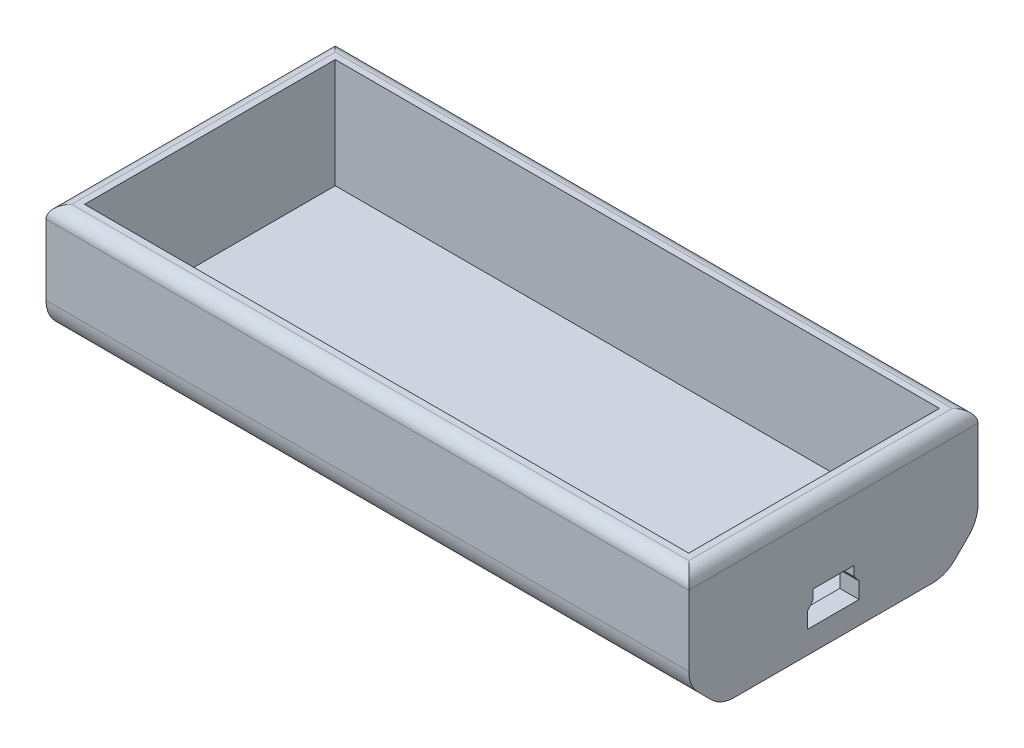
ISO-10303-21;
HEADER;
FILE_DESCRIPTION(('STEP AP214'),'2;1');
FILE_NAME('part.step','',(''),(''),'','','');
FILE_SCHEMA(('AUTOMOTIVE_DESIGN { 1 0 10303 214 1 1 1 1 }'));
ENDSEC;
DATA;
#1=APPLICATION_CONTEXT('core data for automotive mechanical design processes');
#2=APPLICATION_PROTOCOL_DEFINITION('international standard','automotive_design',2000,#1);
#3=PRODUCT_CONTEXT('',#1,'mechanical');
#4=PRODUCT('Part','Part','',(#3));
#5=PRODUCT_RELATED_PRODUCT_CATEGORY('part','',(#4));
#6=PRODUCT_DEFINITION_FORMATION('','',#4);
#7=PRODUCT_DEFINITION_CONTEXT('part definition',#1,'design');
#8=PRODUCT_DEFINITION('design','',#6,#7);
#9=PRODUCT_DEFINITION_SHAPE('','',#8);
#10=(LENGTH_UNIT() NAMED_UNIT(*) SI_UNIT(.MILLI.,.METRE.));
#11=(NAMED_UNIT(*) PLANE_ANGLE_UNIT() SI_UNIT($,.RADIAN.));
#12=(NAMED_UNIT(*) SI_UNIT($,.STERADIAN.) SOLID_ANGLE_UNIT());
#13=UNCERTAINTY_MEASURE_WITH_UNIT(LENGTH_MEASURE(1.E-05),#10,'distance_accuracy_value','');
#14=(GEOMETRIC_REPRESENTATION_CONTEXT(3) GLOBAL_UNCERTAINTY_ASSIGNED_CONTEXT((#13)) GLOBAL_UNIT_ASSIGNED_CONTEXT((#10,
#11,#12)) REPRESENTATION_CONTEXT('',''));
#15=CARTESIAN_POINT('',(0.,0.,0.));
#16=DIRECTION('',(0.,0.,1.));
#17=DIRECTION('',(1.,0.,0.));
#18=AXIS2_PLACEMENT_3D('',#15,#16,#17);
#19=CARTESIAN_POINT('',(50.,20.,-22.5));
#20=DIRECTION('',(-1.,0.,0.));
#21=DIRECTION('',(0.,0.,1.));
#22=AXIS2_PLACEMENT_3D('',#19,#20,#21);
#23=PLANE('',#22);
#24=DIRECTION('',(0.,-1.,0.));
#25=VECTOR('',#24,1.);
#26=CARTESIAN_POINT('',(50.,20.,-22.5));
#27=LINE('',#26,#25);
#28=CARTESIAN_POINT('',(50.,18.,-22.5));
#29=VERTEX_POINT('',#28);
#30=CARTESIAN_POINT('',(50.,7.07106781186547,-22.5));
#31=VERTEX_POINT('',#30);
#32=EDGE_CURVE('E289',#29,#31,#27,.T.);
#33=ORIENTED_EDGE('',*,*,#32,.F.);
#34=DIRECTION('',(0.,0.,-1.));
#35=VECTOR('',#34,1.);
#36=CARTESIAN_POINT('',(50.,18.,22.5));
#37=LINE('',#36,#35);
#38=CARTESIAN_POINT('',(50.,18.,22.5));
#39=VERTEX_POINT('',#38);
#40=EDGE_CURVE('E498',#29,#39,#37,.F.);
#41=ORIENTED_EDGE('',*,*,#40,.T.);
#42=DIRECTION('',(0.,-1.,0.));
#43=VECTOR('',#42,1.);
#44=CARTESIAN_POINT('',(50.,20.,22.5));
#45=LINE('',#44,#43);
#46=CARTESIAN_POINT('',(50.,7.07106781186547,22.5));
#47=VERTEX_POINT('',#46);
#48=EDGE_CURVE('E283',#39,#47,#45,.T.);
#49=ORIENTED_EDGE('',*,*,#48,.T.);
#50=CARTESIAN_POINT('',(50.,7.07106781186547,17.5));
#51=DIRECTION('',(-1.,0.,0.));
#52=DIRECTION('',(0.,0.,1.));
#53=AXIS2_PLACEMENT_3D('',#50,#51,#52);
#54=CIRCLE('',#53,5.);
#55=CARTESIAN_POINT('',(50.,3.53553390593273,21.0355339059327));
#56=VERTEX_POINT('',#55);
#57=EDGE_CURVE('E320',#47,#56,#54,.F.);
#58=ORIENTED_EDGE('',*,*,#57,.T.);
#59=DIRECTION('',(0.,0.707106781186546,0.70710678118655));
#60=VECTOR('',#59,1.);
#61=CARTESIAN_POINT('',(50.,4.99999999999999,22.5));
#62=LINE('',#61,#60);
#63=CARTESIAN_POINT('',(50.,1.46446609406725,18.9644660940672));
#64=VERTEX_POINT('',#63);
#65=EDGE_CURVE('E297',#56,#64,#62,.F.);
#66=ORIENTED_EDGE('',*,*,#65,.T.);
#67=CARTESIAN_POINT('',(50.,5.,15.4289321881345));
#68=DIRECTION('',(-1.,0.,0.));
#69=DIRECTION('',(0.,0.,1.));
#70=AXIS2_PLACEMENT_3D('',#67,#68,#69);
#71=CIRCLE('',#70,5.);
#72=CARTESIAN_POINT('',(50.,0.,15.4289321881345));
#73=VERTEX_POINT('',#72);
#74=EDGE_CURVE('E322',#64,#73,#71,.F.);
#75=ORIENTED_EDGE('',*,*,#74,.T.);
#76=DIRECTION('',(0.,0.,-1.));
#77=VECTOR('',#76,1.);
#78=CARTESIAN_POINT('',(50.,0.,-22.5));
#79=LINE('',#78,#77);
#80=CARTESIAN_POINT('',(50.,0.,-15.4289321881345));
#81=VERTEX_POINT('',#80);
#82=EDGE_CURVE('E257',#73,#81,#79,.T.);
#83=ORIENTED_EDGE('',*,*,#82,.T.);
#84=CARTESIAN_POINT('',(50.,5.,-15.4289321881345));
#85=DIRECTION('',(-1.,0.,0.));
#86=DIRECTION('',(0.,0.,1.));
#87=AXIS2_PLACEMENT_3D('',#84,#85,#86);
#88=CIRCLE('',#87,5.);
#89=CARTESIAN_POINT('',(50.,1.46446609406725,-18.9644660940672));
#90=VERTEX_POINT('',#89);
#91=EDGE_CURVE('E324',#81,#90,#88,.F.);
#92=ORIENTED_EDGE('',*,*,#91,.T.);
#93=DIRECTION('',(0.,-0.707106781186546,0.70710678118655));
#94=VECTOR('',#93,1.);
#95=CARTESIAN_POINT('',(50.,4.99999999999999,-22.5));
#96=LINE('',#95,#94);
#97=CARTESIAN_POINT('',(50.,3.53553390593273,-21.0355339059327));
#98=VERTEX_POINT('',#97);
#99=EDGE_CURVE('E300',#90,#98,#96,.F.);
#100=ORIENTED_EDGE('',*,*,#99,.T.);
#101=CARTESIAN_POINT('',(50.,7.07106781186547,-17.5));
#102=DIRECTION('',(-1.,0.,0.));
#103=DIRECTION('',(0.,0.,1.));
#104=AXIS2_PLACEMENT_3D('',#101,#102,#103);
#105=CIRCLE('',#104,5.);
#106=EDGE_CURVE('E326',#98,#31,#105,.F.);
#107=ORIENTED_EDGE('',*,*,#106,.T.);
#108=EDGE_LOOP('',(#33,#41,#49,#58,#66,#75,#83,#92,#100,#107));
#109=FACE_BOUND('',#108,.T.);
#110=DIRECTION('',(0.,0.780868809443031,-0.624695047554423));
#111=VECTOR('',#110,1.);
#112=CARTESIAN_POINT('',(50.,4.29268292682926,5.36585365853659));
#113=LINE('',#112,#111);
#114=CARTESIAN_POINT('',(50.,6.,4.));
#115=VERTEX_POINT('',#114);
#116=CARTESIAN_POINT('',(50.,7.,3.2));
#117=VERTEX_POINT('',#116);
#118=EDGE_CURVE('E49',#115,#117,#113,.T.);
#119=ORIENTED_EDGE('',*,*,#118,.T.);
#120=DIRECTION('',(0.,-1.,0.));
#121=VECTOR('',#120,1.);
#122=CARTESIAN_POINT('',(50.,0.,3.19999999999999));
#123=LINE('',#122,#121);
#124=CARTESIAN_POINT('',(50.,8.5,3.2));
#125=VERTEX_POINT('',#124);
#126=EDGE_CURVE('E233',#125,#117,#123,.T.);
#127=ORIENTED_EDGE('',*,*,#126,.F.);
#128=DIRECTION('',(0.,0.,-1.));
#129=VECTOR('',#128,1.);
#130=CARTESIAN_POINT('',(50.,8.5,0.));
#131=LINE('',#130,#129);
#132=CARTESIAN_POINT('',(50.,8.5,-3.20000000000001));
#133=VERTEX_POINT('',#132);
#134=EDGE_CURVE('E230',#125,#133,#131,.T.);
#135=ORIENTED_EDGE('',*,*,#134,.T.);
#136=DIRECTION('',(0.,1.,0.));
#137=VECTOR('',#136,1.);
#138=CARTESIAN_POINT('',(50.,0.,-3.20000000000001));
#139=LINE('',#138,#137);
#140=CARTESIAN_POINT('',(50.,7.,-3.20000000000001));
#141=VERTEX_POINT('',#140);
#142=EDGE_CURVE('E227',#141,#133,#139,.T.);
#143=ORIENTED_EDGE('',*,*,#142,.F.);
#144=DIRECTION('',(0.,0.780868809443031,0.624695047554424));
#145=VECTOR('',#144,1.);
#146=CARTESIAN_POINT('',(50.,4.29268292682927,-5.36585365853659));
#147=LINE('',#146,#145);
#148=CARTESIAN_POINT('',(50.,6.,-4.00000000000001));
#149=VERTEX_POINT('',#148);
#150=EDGE_CURVE('E221',#149,#141,#147,.T.);
#151=ORIENTED_EDGE('',*,*,#150,.F.);
#152=DIRECTION('',(0.,-1.,0.));
#153=VECTOR('',#152,1.);
#154=CARTESIAN_POINT('',(50.,0.,-4.00000000000001));
#155=LINE('',#154,#153);
#156=CARTESIAN_POINT('',(50.,3.5,-4.00000000000001));
#157=VERTEX_POINT('',#156);
#158=EDGE_CURVE('E219',#149,#157,#155,.T.);
#159=ORIENTED_EDGE('',*,*,#158,.T.);
#160=DIRECTION('',(0.,0.,-1.));
#161=VECTOR('',#160,1.);
#162=CARTESIAN_POINT('',(50.,3.5,0.));
#163=LINE('',#162,#161);
#164=CARTESIAN_POINT('',(50.,3.5,3.99999999999999));
#165=VERTEX_POINT('',#164);
#166=EDGE_CURVE('E204',#165,#157,#163,.T.);
#167=ORIENTED_EDGE('',*,*,#166,.F.);
#168=DIRECTION('',(0.,-1.,0.));
#169=VECTOR('',#168,1.);
#170=CARTESIAN_POINT('',(50.,0.,3.99999999999999));
#171=LINE('',#170,#169);
#172=EDGE_CURVE('E213',#115,#165,#171,.T.);
#173=ORIENTED_EDGE('',*,*,#172,.F.);
#174=EDGE_LOOP('',(#119,#127,#135,#143,#151,#159,#167,#173));
#175=FACE_BOUND('',#174,.T.);
#176=ADVANCED_FACE('F34',(#109,#175),#23,.F.);
#177=CARTESIAN_POINT('',(47.,20.,-22.5));
#178=DIRECTION('',(-1.,0.,0.));
#179=DIRECTION('',(0.,0.,1.));
#180=AXIS2_PLACEMENT_3D('',#177,#178,#179);
#181=PLANE('',#180);
#182=DIRECTION('',(0.,0.,-1.));
#183=VECTOR('',#182,1.);
#184=CARTESIAN_POINT('',(47.,3.,-22.5));
#185=LINE('',#184,#183);
#186=CARTESIAN_POINT('',(47.,3.,19.5));
#187=VERTEX_POINT('',#186);
#188=CARTESIAN_POINT('',(47.,3.,-19.5));
#189=VERTEX_POINT('',#188);
#190=EDGE_CURVE('E249',#187,#189,#185,.T.);
#191=ORIENTED_EDGE('',*,*,#190,.F.);
#192=DIRECTION('',(0.,-1.,0.));
#193=VECTOR('',#192,1.);
#194=CARTESIAN_POINT('',(47.,20.,19.5));
#195=LINE('',#194,#193);
#196=CARTESIAN_POINT('',(47.,20.,19.5));
#197=VERTEX_POINT('',#196);
#198=EDGE_CURVE('E259',#197,#187,#195,.T.);
#199=ORIENTED_EDGE('',*,*,#198,.F.);
#200=DIRECTION('',(0.,0.,-1.));
#201=VECTOR('',#200,1.);
#202=CARTESIAN_POINT('',(47.,20.,-22.5));
#203=LINE('',#202,#201);
#204=CARTESIAN_POINT('',(47.,20.,-19.5));
#205=VERTEX_POINT('',#204);
#206=EDGE_CURVE('E273',#197,#205,#203,.T.);
#207=ORIENTED_EDGE('',*,*,#206,.T.);
#208=DIRECTION('',(0.,-1.,0.));
#209=VECTOR('',#208,1.);
#210=CARTESIAN_POINT('',(47.,20.,-19.5));
#211=LINE('',#210,#209);
#212=EDGE_CURVE('E254',#205,#189,#211,.T.);
#213=ORIENTED_EDGE('',*,*,#212,.T.);
#214=EDGE_LOOP('',(#191,#199,#207,#213));
#215=FACE_BOUND('',#214,.T.);
#216=DIRECTION('',(0.,1.,0.));
#217=VECTOR('',#216,1.);
#218=CARTESIAN_POINT('',(47.,20.,3.2));
#219=LINE('',#218,#217);
#220=CARTESIAN_POINT('',(47.,7.,3.2));
#221=VERTEX_POINT('',#220);
#222=CARTESIAN_POINT('',(47.,8.5,3.2));
#223=VERTEX_POINT('',#222);
#224=EDGE_CURVE('E42',#221,#223,#219,.T.);
#225=ORIENTED_EDGE('',*,*,#224,.F.);
#226=DIRECTION('',(0.,-0.780868809443031,0.624695047554423));
#227=VECTOR('',#226,1.);
#228=CARTESIAN_POINT('',(47.,27.4634146341463,-13.170731707317));
#229=LINE('',#228,#227);
#230=CARTESIAN_POINT('',(47.,6.,4.));
#231=VERTEX_POINT('',#230);
#232=EDGE_CURVE('E11',#221,#231,#229,.T.);
#233=ORIENTED_EDGE('',*,*,#232,.T.);
#234=DIRECTION('',(0.,1.,0.));
#235=VECTOR('',#234,1.);
#236=CARTESIAN_POINT('',(47.,20.,4.00000000000001));
#237=LINE('',#236,#235);
#238=CARTESIAN_POINT('',(47.,3.5,3.99999999999999));
#239=VERTEX_POINT('',#238);
#240=EDGE_CURVE('E482',#239,#231,#237,.T.);
#241=ORIENTED_EDGE('',*,*,#240,.F.);
#242=DIRECTION('',(0.,0.,1.));
#243=VECTOR('',#242,1.);
#244=CARTESIAN_POINT('',(47.,3.49999999999999,-22.5));
#245=LINE('',#244,#243);
#246=CARTESIAN_POINT('',(47.,3.5,-4.00000000000001));
#247=VERTEX_POINT('',#246);
#248=EDGE_CURVE('E207',#247,#239,#245,.T.);
#249=ORIENTED_EDGE('',*,*,#248,.F.);
#250=DIRECTION('',(0.,1.,0.));
#251=VECTOR('',#250,1.);
#252=CARTESIAN_POINT('',(47.,20.,-4.));
#253=LINE('',#252,#251);
#254=CARTESIAN_POINT('',(47.,6.,-4.00000000000001));
#255=VERTEX_POINT('',#254);
#256=EDGE_CURVE('E478',#247,#255,#253,.T.);
#257=ORIENTED_EDGE('',*,*,#256,.T.);
#258=DIRECTION('',(0.,-0.780868809443031,-0.624695047554424));
#259=VECTOR('',#258,1.);
#260=CARTESIAN_POINT('',(47.,5.51219512195123,-4.39024390243901));
#261=LINE('',#260,#259);
#262=CARTESIAN_POINT('',(47.,7.,-3.20000000000001));
#263=VERTEX_POINT('',#262);
#264=EDGE_CURVE('E474',#263,#255,#261,.T.);
#265=ORIENTED_EDGE('',*,*,#264,.F.);
#266=DIRECTION('',(0.,-1.,0.));
#267=VECTOR('',#266,1.);
#268=CARTESIAN_POINT('',(47.,20.,-3.20000000000001));
#269=LINE('',#268,#267);
#270=CARTESIAN_POINT('',(47.,8.5,-3.20000000000001));
#271=VERTEX_POINT('',#270);
#272=EDGE_CURVE('E472',#271,#263,#269,.T.);
#273=ORIENTED_EDGE('',*,*,#272,.F.);
#274=DIRECTION('',(0.,0.,1.));
#275=VECTOR('',#274,1.);
#276=CARTESIAN_POINT('',(47.,8.5,-22.5));
#277=LINE('',#276,#275);
#278=EDGE_CURVE('E467',#271,#223,#277,.T.);
#279=ORIENTED_EDGE('',*,*,#278,.T.);
#280=EDGE_LOOP('',(#225,#233,#241,#249,#257,#265,#273,#279));
#281=FACE_BOUND('',#280,.T.);
#282=ADVANCED_FACE('F393',(#215,#281),#181,.T.);
#283=CARTESIAN_POINT('',(-50.,20.,-22.5));
#284=DIRECTION('',(0.,0.,1.));
#285=DIRECTION('',(1.,0.,0.));
#286=AXIS2_PLACEMENT_3D('',#283,#284,#285);
#287=PLANE('',#286);
#288=DIRECTION('',(0.,-1.,0.));
#289=VECTOR('',#288,1.);
#290=CARTESIAN_POINT('',(-50.,20.,-22.5));
#291=LINE('',#290,#289);
#292=CARTESIAN_POINT('',(-50.,18.,-22.5));
#293=VERTEX_POINT('',#292);
#294=CARTESIAN_POINT('',(-50.,7.07106781186547,-22.5));
#295=VERTEX_POINT('',#294);
#296=EDGE_CURVE('E287',#293,#295,#291,.T.);
#297=ORIENTED_EDGE('',*,*,#296,.F.);
#298=DIRECTION('',(-1.,0.,0.));
#299=VECTOR('',#298,1.);
#300=CARTESIAN_POINT('',(50.,18.,-22.5));
#301=LINE('',#300,#299);
#302=EDGE_CURVE('E496',#293,#29,#301,.F.);
#303=ORIENTED_EDGE('',*,*,#302,.T.);
#304=ORIENTED_EDGE('',*,*,#32,.T.);
#305=DIRECTION('',(1.,0.,0.));
#306=VECTOR('',#305,1.);
#307=CARTESIAN_POINT('',(-50.,7.07106781186547,-22.5));
#308=LINE('',#307,#306);
#309=EDGE_CURVE('E303',#31,#295,#308,.F.);
#310=ORIENTED_EDGE('',*,*,#309,.T.);
#311=EDGE_LOOP('',(#297,#303,#304,#310));
#312=FACE_BOUND('',#311,.T.);
#313=ADVANCED_FACE('F395',(#312),#287,.F.);
#314=CARTESIAN_POINT('',(-50.,20.,-22.5));
#315=DIRECTION('',(1.,0.,0.));
#316=DIRECTION('',(0.,0.,-1.));
#317=AXIS2_PLACEMENT_3D('',#314,#315,#316);
#318=PLANE('',#317);
#319=DIRECTION('',(0.,-1.,0.));
#320=VECTOR('',#319,1.);
#321=CARTESIAN_POINT('',(-50.,20.,22.5));
#322=LINE('',#321,#320);
#323=CARTESIAN_POINT('',(-50.,18.,22.5));
#324=VERTEX_POINT('',#323);
#325=CARTESIAN_POINT('',(-50.,7.07106781186547,22.5));
#326=VERTEX_POINT('',#325);
#327=EDGE_CURVE('E285',#324,#326,#322,.T.);
#328=ORIENTED_EDGE('',*,*,#327,.F.);
#329=DIRECTION('',(0.,0.,1.));
#330=VECTOR('',#329,1.);
#331=CARTESIAN_POINT('',(-50.,18.,-22.5));
#332=LINE('',#331,#330);
#333=EDGE_CURVE('E494',#324,#293,#332,.F.);
#334=ORIENTED_EDGE('',*,*,#333,.T.);
#335=ORIENTED_EDGE('',*,*,#296,.T.);
#336=CARTESIAN_POINT('',(-50.,7.07106781186547,-17.5));
#337=DIRECTION('',(1.,0.,0.));
#338=DIRECTION('',(0.,0.,-1.));
#339=AXIS2_PLACEMENT_3D('',#336,#337,#338);
#340=CIRCLE('',#339,5.);
#341=CARTESIAN_POINT('',(-50.,3.53553390593273,-21.0355339059327));
#342=VERTEX_POINT('',#341);
#343=EDGE_CURVE('E314',#295,#342,#340,.F.);
#344=ORIENTED_EDGE('',*,*,#343,.T.);
#345=DIRECTION('',(0.,0.707106781186546,-0.70710678118655));
#346=VECTOR('',#345,1.);
#347=CARTESIAN_POINT('',(-50.,4.99999999999999,-22.5));
#348=LINE('',#347,#346);
#349=CARTESIAN_POINT('',(-50.,1.46446609406725,-18.9644660940672));
#350=VERTEX_POINT('',#349);
#351=EDGE_CURVE('E294',#342,#350,#348,.F.);
#352=ORIENTED_EDGE('',*,*,#351,.T.);
#353=CARTESIAN_POINT('',(-50.,5.,-15.4289321881345));
#354=DIRECTION('',(1.,0.,0.));
#355=DIRECTION('',(0.,0.,-1.));
#356=AXIS2_PLACEMENT_3D('',#353,#354,#355);
#357=CIRCLE('',#356,5.);
#358=CARTESIAN_POINT('',(-50.,1.,-18.4289321881345));
#359=VERTEX_POINT('',#358);
#360=EDGE_CURVE('E311',#350,#359,#357,.F.);
#361=ORIENTED_EDGE('',*,*,#360,.T.);
#362=DIRECTION('',(0.,0.,1.));
#363=VECTOR('',#362,1.);
#364=CARTESIAN_POINT('',(-50.,1.,-22.5));
#365=LINE('',#364,#363);
#366=CARTESIAN_POINT('',(-50.,1.,18.4289321881345));
#367=VERTEX_POINT('',#366);
#368=EDGE_CURVE('E341',#359,#367,#365,.T.);
#369=ORIENTED_EDGE('',*,*,#368,.T.);
#370=CARTESIAN_POINT('',(-50.,5.,15.4289321881345));
#371=DIRECTION('',(1.,0.,0.));
#372=DIRECTION('',(0.,0.,-1.));
#373=AXIS2_PLACEMENT_3D('',#370,#371,#372);
#374=CIRCLE('',#373,5.);
#375=CARTESIAN_POINT('',(-50.,1.46446609406725,18.9644660940672));
#376=VERTEX_POINT('',#375);
#377=EDGE_CURVE('E309',#367,#376,#374,.F.);
#378=ORIENTED_EDGE('',*,*,#377,.T.);
#379=DIRECTION('',(0.,-0.707106781186546,-0.70710678118655));
#380=VECTOR('',#379,1.);
#381=CARTESIAN_POINT('',(-50.,4.99999999999999,22.5));
#382=LINE('',#381,#380);
#383=CARTESIAN_POINT('',(-50.,3.53553390593273,21.0355339059327));
#384=VERTEX_POINT('',#383);
#385=EDGE_CURVE('E291',#376,#384,#382,.F.);
#386=ORIENTED_EDGE('',*,*,#385,.T.);
#387=CARTESIAN_POINT('',(-50.,7.07106781186547,17.5));
#388=DIRECTION('',(1.,0.,0.));
#389=DIRECTION('',(0.,0.,-1.));
#390=AXIS2_PLACEMENT_3D('',#387,#388,#389);
#391=CIRCLE('',#390,5.);
#392=EDGE_CURVE('E306',#384,#326,#391,.F.);
#393=ORIENTED_EDGE('',*,*,#392,.T.);
#394=EDGE_LOOP('',(#328,#334,#335,#344,#352,#361,#369,#378,#386,#393));
#395=FACE_BOUND('',#394,.T.);
#396=ADVANCED_FACE('F398',(#395),#318,.F.);
#397=CARTESIAN_POINT('',(-50.,20.,22.5));
#398=DIRECTION('',(0.,0.,-1.));
#399=DIRECTION('',(-1.,0.,0.));
#400=AXIS2_PLACEMENT_3D('',#397,#398,#399);
#401=PLANE('',#400);
#402=ORIENTED_EDGE('',*,*,#48,.F.);
#403=DIRECTION('',(1.,0.,0.));
#404=VECTOR('',#403,1.);
#405=CARTESIAN_POINT('',(-50.,18.,22.5));
#406=LINE('',#405,#404);
#407=EDGE_CURVE('E484',#39,#324,#406,.F.);
#408=ORIENTED_EDGE('',*,*,#407,.T.);
#409=ORIENTED_EDGE('',*,*,#327,.T.);
#410=DIRECTION('',(-1.,0.,0.));
#411=VECTOR('',#410,1.);
#412=CARTESIAN_POINT('',(50.,7.07106781186547,22.5));
#413=LINE('',#412,#411);
#414=EDGE_CURVE('E338',#326,#47,#413,.F.);
#415=ORIENTED_EDGE('',*,*,#414,.T.);
#416=EDGE_LOOP('',(#402,#408,#409,#415));
#417=FACE_BOUND('',#416,.T.);
#418=ADVANCED_FACE('F402',(#417),#401,.F.);
#419=CARTESIAN_POINT('',(0.,20.,0.));
#420=DIRECTION('',(0.,1.,0.));
#421=DIRECTION('',(0.,0.,1.));
#422=AXIS2_PLACEMENT_3D('',#419,#420,#421);
#423=PLANE('',#422);
#424=DIRECTION('',(1.,0.,0.));
#425=VECTOR('',#424,1.);
#426=CARTESIAN_POINT('',(50.,20.,20.5));
#427=LINE('',#426,#425);
#428=CARTESIAN_POINT('',(-48.,20.,20.5));
#429=VERTEX_POINT('',#428);
#430=CARTESIAN_POINT('',(48.,20.,20.5));
#431=VERTEX_POINT('',#430);
#432=EDGE_CURVE('E371',#429,#431,#427,.T.);
#433=ORIENTED_EDGE('',*,*,#432,.T.);
#434=DIRECTION('',(0.,0.,-1.));
#435=VECTOR('',#434,1.);
#436=CARTESIAN_POINT('',(48.,20.,-22.5));
#437=LINE('',#436,#435);
#438=CARTESIAN_POINT('',(48.,20.,-20.5));
#439=VERTEX_POINT('',#438);
#440=EDGE_CURVE('E501',#431,#439,#437,.T.);
#441=ORIENTED_EDGE('',*,*,#440,.T.);
#442=DIRECTION('',(-1.,0.,0.));
#443=VECTOR('',#442,1.);
#444=CARTESIAN_POINT('',(-50.,20.,-20.5));
#445=LINE('',#444,#443);
#446=CARTESIAN_POINT('',(-48.,20.,-20.5));
#447=VERTEX_POINT('',#446);
#448=EDGE_CURVE('E504',#439,#447,#445,.T.);
#449=ORIENTED_EDGE('',*,*,#448,.T.);
#450=DIRECTION('',(0.,0.,1.));
#451=VECTOR('',#450,1.);
#452=CARTESIAN_POINT('',(-48.,20.,22.5));
#453=LINE('',#452,#451);
#454=EDGE_CURVE('E505',#447,#429,#453,.T.);
#455=ORIENTED_EDGE('',*,*,#454,.T.);
#456=EDGE_LOOP('',(#433,#441,#449,#455));
#457=FACE_BOUND('',#456,.T.);
#458=ORIENTED_EDGE('',*,*,#206,.F.);
#459=DIRECTION('',(1.,0.,0.));
#460=VECTOR('',#459,1.);
#461=CARTESIAN_POINT('',(-50.,20.,19.5));
#462=LINE('',#461,#460);
#463=CARTESIAN_POINT('',(-47.,20.,19.5));
#464=VERTEX_POINT('',#463);
#465=EDGE_CURVE('E263',#464,#197,#462,.T.);
#466=ORIENTED_EDGE('',*,*,#465,.F.);
#467=DIRECTION('',(0.,0.,1.));
#468=VECTOR('',#467,1.);
#469=CARTESIAN_POINT('',(-47.,20.,-22.5));
#470=LINE('',#469,#468);
#471=CARTESIAN_POINT('',(-47.,20.,-19.5));
#472=VERTEX_POINT('',#471);
#473=EDGE_CURVE('E277',#472,#464,#470,.T.);
#474=ORIENTED_EDGE('',*,*,#473,.F.);
#475=DIRECTION('',(-1.,0.,0.));
#476=VECTOR('',#475,1.);
#477=CARTESIAN_POINT('',(-50.,20.,-19.5));
#478=LINE('',#477,#476);
#479=EDGE_CURVE('E275',#205,#472,#478,.T.);
#480=ORIENTED_EDGE('',*,*,#479,.F.);
#481=EDGE_LOOP('',(#458,#466,#474,#480));
#482=FACE_BOUND('',#481,.T.);
#483=ADVANCED_FACE('F406',(#457,#482),#423,.T.);
#484=CARTESIAN_POINT('',(0.,0.,0.));
#485=DIRECTION('',(0.,1.,0.));
#486=DIRECTION('',(0.,0.,1.));
#487=AXIS2_PLACEMENT_3D('',#484,#485,#486);
#488=PLANE('',#487);
#489=DIRECTION('',(1.,0.,0.));
#490=VECTOR('',#489,1.);
#491=CARTESIAN_POINT('',(-50.,0.,15.4289321881345));
#492=LINE('',#491,#490);
#493=CARTESIAN_POINT('',(-49.,0.,15.4289321881345));
#494=VERTEX_POINT('',#493);
#495=EDGE_CURVE('E329',#73,#494,#492,.F.);
#496=ORIENTED_EDGE('',*,*,#495,.T.);
#497=DIRECTION('',(0.,0.,1.));
#498=VECTOR('',#497,1.);
#499=CARTESIAN_POINT('',(-49.,0.,0.));
#500=LINE('',#499,#498);
#501=CARTESIAN_POINT('',(-49.,0.,-15.4289321881345));
#502=VERTEX_POINT('',#501);
#503=EDGE_CURVE('E351',#494,#502,#500,.F.);
#504=ORIENTED_EDGE('',*,*,#503,.T.);
#505=DIRECTION('',(-1.,0.,0.));
#506=VECTOR('',#505,1.);
#507=CARTESIAN_POINT('',(50.,0.,-15.4289321881345));
#508=LINE('',#507,#506);
#509=EDGE_CURVE('E332',#502,#81,#508,.F.);
#510=ORIENTED_EDGE('',*,*,#509,.T.);
#511=ORIENTED_EDGE('',*,*,#82,.F.);
#512=EDGE_LOOP('',(#496,#504,#510,#511));
#513=FACE_BOUND('',#512,.T.);
#514=ADVANCED_FACE('F408',(#513),#488,.F.);
#515=CARTESIAN_POINT('',(-50.,20.,-19.5));
#516=DIRECTION('',(0.,0.,1.));
#517=DIRECTION('',(1.,0.,0.));
#518=AXIS2_PLACEMENT_3D('',#515,#516,#517);
#519=PLANE('',#518);
#520=DIRECTION('',(-1.,0.,0.));
#521=VECTOR('',#520,1.);
#522=CARTESIAN_POINT('',(-50.,3.,-19.5));
#523=LINE('',#522,#521);
#524=CARTESIAN_POINT('',(-47.,3.,-19.5));
#525=VERTEX_POINT('',#524);
#526=EDGE_CURVE('E252',#189,#525,#523,.T.);
#527=ORIENTED_EDGE('',*,*,#526,.F.);
#528=ORIENTED_EDGE('',*,*,#212,.F.);
#529=ORIENTED_EDGE('',*,*,#479,.T.);
#530=DIRECTION('',(0.,-1.,0.));
#531=VECTOR('',#530,1.);
#532=CARTESIAN_POINT('',(-47.,20.,-19.5));
#533=LINE('',#532,#531);
#534=EDGE_CURVE('E258',#472,#525,#533,.T.);
#535=ORIENTED_EDGE('',*,*,#534,.T.);
#536=EDGE_LOOP('',(#527,#528,#529,#535));
#537=FACE_BOUND('',#536,.T.);
#538=ADVANCED_FACE('F411',(#537),#519,.T.);
#539=CARTESIAN_POINT('',(-47.,20.,-22.5));
#540=DIRECTION('',(1.,0.,0.));
#541=DIRECTION('',(0.,0.,-1.));
#542=AXIS2_PLACEMENT_3D('',#539,#540,#541);
#543=PLANE('',#542);
#544=DIRECTION('',(0.,0.,1.));
#545=VECTOR('',#544,1.);
#546=CARTESIAN_POINT('',(-47.,3.,-22.5));
#547=LINE('',#546,#545);
#548=CARTESIAN_POINT('',(-47.,3.,19.5));
#549=VERTEX_POINT('',#548);
#550=EDGE_CURVE('E265',#525,#549,#547,.T.);
#551=ORIENTED_EDGE('',*,*,#550,.F.);
#552=ORIENTED_EDGE('',*,*,#534,.F.);
#553=ORIENTED_EDGE('',*,*,#473,.T.);
#554=DIRECTION('',(0.,-1.,0.));
#555=VECTOR('',#554,1.);
#556=CARTESIAN_POINT('',(-47.,20.,19.5));
#557=LINE('',#556,#555);
#558=EDGE_CURVE('E262',#464,#549,#557,.T.);
#559=ORIENTED_EDGE('',*,*,#558,.T.);
#560=EDGE_LOOP('',(#551,#552,#553,#559));
#561=FACE_BOUND('',#560,.T.);
#562=ADVANCED_FACE('F422',(#561),#543,.T.);
#563=CARTESIAN_POINT('',(-50.,20.,19.5));
#564=DIRECTION('',(0.,0.,-1.));
#565=DIRECTION('',(-1.,0.,0.));
#566=AXIS2_PLACEMENT_3D('',#563,#564,#565);
#567=PLANE('',#566);
#568=DIRECTION('',(1.,0.,0.));
#569=VECTOR('',#568,1.);
#570=CARTESIAN_POINT('',(-50.,3.,19.5));
#571=LINE('',#570,#569);
#572=EDGE_CURVE('E269',#549,#187,#571,.T.);
#573=ORIENTED_EDGE('',*,*,#572,.F.);
#574=ORIENTED_EDGE('',*,*,#558,.F.);
#575=ORIENTED_EDGE('',*,*,#465,.T.);
#576=ORIENTED_EDGE('',*,*,#198,.T.);
#577=EDGE_LOOP('',(#573,#574,#575,#576));
#578=FACE_BOUND('',#577,.T.);
#579=ADVANCED_FACE('F418',(#578),#567,.T.);
#580=CARTESIAN_POINT('',(0.,3.,0.));
#581=DIRECTION('',(0.,1.,0.));
#582=DIRECTION('',(0.,0.,1.));
#583=AXIS2_PLACEMENT_3D('',#580,#581,#582);
#584=PLANE('',#583);
#585=ORIENTED_EDGE('',*,*,#190,.T.);
#586=ORIENTED_EDGE('',*,*,#526,.T.);
#587=ORIENTED_EDGE('',*,*,#550,.T.);
#588=ORIENTED_EDGE('',*,*,#572,.T.);
#589=EDGE_LOOP('',(#585,#586,#587,#588));
#590=FACE_BOUND('',#589,.T.);
#591=ADVANCED_FACE('F389',(#590),#584,.T.);
#592=CARTESIAN_POINT('',(-50.,4.99999999999999,-22.5));
#593=DIRECTION('',(0.,0.707106781186549,0.707106781186545));
#594=DIRECTION('',(-1.,0.,0.));
#595=AXIS2_PLACEMENT_3D('',#592,#593,#594);
#596=PLANE('',#595);
#597=ORIENTED_EDGE('',*,*,#351,.F.);
#598=DIRECTION('',(-1.,0.,0.));
#599=VECTOR('',#598,1.);
#600=CARTESIAN_POINT('',(50.,3.53553390593273,-21.0355339059327));
#601=LINE('',#600,#599);
#602=EDGE_CURVE('E318',#342,#98,#601,.F.);
#603=ORIENTED_EDGE('',*,*,#602,.T.);
#604=ORIENTED_EDGE('',*,*,#99,.F.);
#605=DIRECTION('',(1.,0.,0.));
#606=VECTOR('',#605,1.);
#607=CARTESIAN_POINT('',(-50.,1.46446609406725,-18.9644660940672));
#608=LINE('',#607,#606);
#609=EDGE_CURVE('E316',#90,#350,#608,.F.);
#610=ORIENTED_EDGE('',*,*,#609,.T.);
#611=EDGE_LOOP('',(#597,#603,#604,#610));
#612=FACE_BOUND('',#611,.T.);
#613=ADVANCED_FACE('F385',(#612),#596,.F.);
#614=CARTESIAN_POINT('',(-50.,4.99999999999999,22.5));
#615=DIRECTION('',(0.,0.707106781186549,-0.707106781186545));
#616=DIRECTION('',(1.,0.,0.));
#617=AXIS2_PLACEMENT_3D('',#614,#615,#616);
#618=PLANE('',#617);
#619=ORIENTED_EDGE('',*,*,#385,.F.);
#620=DIRECTION('',(-1.,0.,0.));
#621=VECTOR('',#620,1.);
#622=CARTESIAN_POINT('',(50.,1.46446609406725,18.9644660940672));
#623=LINE('',#622,#621);
#624=EDGE_CURVE('E336',#376,#64,#623,.F.);
#625=ORIENTED_EDGE('',*,*,#624,.T.);
#626=ORIENTED_EDGE('',*,*,#65,.F.);
#627=DIRECTION('',(1.,0.,0.));
#628=VECTOR('',#627,1.);
#629=CARTESIAN_POINT('',(-50.,3.53553390593273,21.0355339059327));
#630=LINE('',#629,#628);
#631=EDGE_CURVE('E334',#56,#384,#630,.F.);
#632=ORIENTED_EDGE('',*,*,#631,.T.);
#633=EDGE_LOOP('',(#619,#625,#626,#632));
#634=FACE_BOUND('',#633,.T.);
#635=ADVANCED_FACE('F381',(#634),#618,.F.);
#636=CARTESIAN_POINT('',(-50.,7.07106781186547,-17.5));
#637=DIRECTION('',(-1.,0.,0.));
#638=DIRECTION('',(0.,0.,1.));
#639=AXIS2_PLACEMENT_3D('',#636,#637,#638);
#640=CYLINDRICAL_SURFACE('',#639,5.);
#641=ORIENTED_EDGE('',*,*,#106,.F.);
#642=ORIENTED_EDGE('',*,*,#602,.F.);
#643=ORIENTED_EDGE('',*,*,#343,.F.);
#644=ORIENTED_EDGE('',*,*,#309,.F.);
#645=EDGE_LOOP('',(#641,#642,#643,#644));
#646=FACE_BOUND('',#645,.T.);
#647=ADVANCED_FACE('F377',(#646),#640,.T.);
#648=CARTESIAN_POINT('',(0.,5.,-15.4289321881345));
#649=DIRECTION('',(1.,0.,0.));
#650=DIRECTION('',(0.,0.,-1.));
#651=AXIS2_PLACEMENT_3D('',#648,#649,#650);
#652=CYLINDRICAL_SURFACE('',#651,5.);
#653=ORIENTED_EDGE('',*,*,#509,.F.);
#654=CARTESIAN_POINT('',(-50.,1.,-18.4289321881345));
#655=CARTESIAN_POINT('',(-49.9999628376629,0.952695439093064,-18.365876883441));
#656=CARTESIAN_POINT('',(-49.9966475188885,0.906948401167836,-18.3017574713421));
#657=CARTESIAN_POINT('',(-49.9844642159685,0.818832264413215,-18.1719144638461));
#658=CARTESIAN_POINT('',(-49.975606800219,0.776456908982671,-18.1061941499814));
#659=CARTESIAN_POINT('',(-49.9534106318151,0.695440938526177,-17.9738798935407));
#660=CARTESIAN_POINT('',(-49.9401026182387,0.65677698529485,-17.9072948754627));
#661=CARTESIAN_POINT('',(-49.9097269176582,0.58287395537812,-17.7730464951565));
#662=CARTESIAN_POINT('',(-49.8926567600438,0.547637151330254,-17.7053824515431));
#663=CARTESIAN_POINT('',(-49.8435310534267,0.45926114729799,-17.5258621109999));
#664=CARTESIAN_POINT('',(-49.8088536971532,0.409005526824127,-17.4132948265966));
#665=CARTESIAN_POINT('',(-49.7333093052932,0.317521554155577,-17.1865877260103));
#666=CARTESIAN_POINT('',(-49.6924396507108,0.27629703974416,-17.0724472631174));
#667=CARTESIAN_POINT('',(-49.6059885385923,0.202491509195879,-16.842627068272));
#668=CARTESIAN_POINT('',(-49.5603893855202,0.169944709614677,-16.7269430779625));
#669=CARTESIAN_POINT('',(-49.4659520382432,0.113482168452191,-16.4948601230917));
#670=CARTESIAN_POINT('',(-49.4171148922727,0.0895636496348702,-16.378461400876));
#671=CARTESIAN_POINT('',(-49.3088464332046,0.0468208653339034,-16.1254559938625));
#672=CARTESIAN_POINT('',(-49.2490194425751,0.0295404403108834,-15.9887583003841));
#673=CARTESIAN_POINT('',(-49.1280500788674,0.00632651981242034,-15.715305146854));
#674=CARTESIAN_POINT('',(-49.066910693132,0.000369551469723036,-15.5785503953696));
#675=CARTESIAN_POINT('',(-49.0038489814604,5.55844377131439E-06,-15.4375387742488));
#676=CARTESIAN_POINT('',(-49.001924478426,3.22475572326703E-09,-15.433235454776));
#677=CARTESIAN_POINT('',(-49.,0.,-15.4289321881345));
#678=B_SPLINE_CURVE_WITH_KNOTS('',3,(#654,#655,#656,#657,#658,#659,#660,#661,#662,#663,#664,
#665,#666,#667,#668,#669,#670,#671,#672,#673,#674,#675,#676,#677),.UNSPECIFIED.,.F.,.F.,(4,2,2,
2,2,2,2,2,2,2,2,4),(0.,0.236272200851011,0.472095214354458,0.706321989678098,0.940703043144721,
1.3242927535572,1.70804515619832,2.0932890514322,2.47840883504632,2.92860728181176,
3.37787147131305,3.39201361675778),.UNSPECIFIED.);
#679=EDGE_CURVE('E366',#502,#359,#678,.F.);
#680=ORIENTED_EDGE('',*,*,#679,.T.);
#681=ORIENTED_EDGE('',*,*,#360,.F.);
#682=ORIENTED_EDGE('',*,*,#609,.F.);
#683=ORIENTED_EDGE('',*,*,#91,.F.);
#684=EDGE_LOOP('',(#653,#680,#681,#682,#683));
#685=FACE_BOUND('',#684,.T.);
#686=ADVANCED_FACE('F373',(#685),#652,.T.);
#687=CARTESIAN_POINT('',(0.,5.,15.4289321881345));
#688=DIRECTION('',(-1.,0.,0.));
#689=DIRECTION('',(0.,0.,1.));
#690=AXIS2_PLACEMENT_3D('',#687,#688,#689);
#691=CYLINDRICAL_SURFACE('',#690,5.);
#692=ORIENTED_EDGE('',*,*,#377,.F.);
#693=CARTESIAN_POINT('',(-50.,1.,18.4289321881345));
#694=CARTESIAN_POINT('',(-49.9999628376629,0.952695439093064,18.365876883441));
#695=CARTESIAN_POINT('',(-49.9966475188885,0.906948401167836,18.3017574713421));
#696=CARTESIAN_POINT('',(-49.9844642159685,0.818832264413215,18.1719144638461));
#697=CARTESIAN_POINT('',(-49.975606800219,0.776456908982671,18.1061941499814));
#698=CARTESIAN_POINT('',(-49.9534106318151,0.695440938526177,17.9738798935407));
#699=CARTESIAN_POINT('',(-49.9401026182387,0.65677698529485,17.9072948754627));
#700=CARTESIAN_POINT('',(-49.9097269176582,0.58287395537812,17.7730464951565));
#701=CARTESIAN_POINT('',(-49.8926567600438,0.547637151330254,17.7053824515431));
#702=CARTESIAN_POINT('',(-49.8435310534267,0.45926114729799,17.5258621109999));
#703=CARTESIAN_POINT('',(-49.8088536971532,0.409005526824127,17.4132948265966));
#704=CARTESIAN_POINT('',(-49.7333093052932,0.317521554155577,17.1865877260103));
#705=CARTESIAN_POINT('',(-49.6924396507108,0.27629703974416,17.0724472631174));
#706=CARTESIAN_POINT('',(-49.6059885385923,0.202491509195879,16.842627068272));
#707=CARTESIAN_POINT('',(-49.5603893855202,0.169944709614677,16.7269430779625));
#708=CARTESIAN_POINT('',(-49.4659520382432,0.113482168452191,16.4948601230917));
#709=CARTESIAN_POINT('',(-49.4171148922727,0.0895636496348702,16.378461400876));
#710=CARTESIAN_POINT('',(-49.3088464332046,0.0468208653339034,16.1254559938625));
#711=CARTESIAN_POINT('',(-49.2490194425751,0.0295404403108834,15.9887583003841));
#712=CARTESIAN_POINT('',(-49.1280500788674,0.00632651981242034,15.715305146854));
#713=CARTESIAN_POINT('',(-49.066910693132,0.000369551469723036,15.5785503953696));
#714=CARTESIAN_POINT('',(-49.0038489814604,5.55844377131439E-06,15.4375387742488));
#715=CARTESIAN_POINT('',(-49.001924478426,3.22475572326703E-09,15.433235454776));
#716=CARTESIAN_POINT('',(-49.,0.,15.4289321881345));
#717=B_SPLINE_CURVE_WITH_KNOTS('',3,(#693,#694,#695,#696,#697,#698,#699,#700,#701,#702,#703,
#704,#705,#706,#707,#708,#709,#710,#711,#712,#713,#714,#715,#716),.UNSPECIFIED.,.F.,.F.,(4,2,2,
2,2,2,2,2,2,2,2,4),(0.,0.236272200851011,0.472095214354458,0.706321989678098,0.940703043144721,
1.3242927535572,1.70804515619832,2.0932890514322,2.47840883504632,2.92860728181176,
3.37787147131305,3.39201361675778),.UNSPECIFIED.);
#718=EDGE_CURVE('E344',#367,#494,#717,.T.);
#719=ORIENTED_EDGE('',*,*,#718,.T.);
#720=ORIENTED_EDGE('',*,*,#495,.F.);
#721=ORIENTED_EDGE('',*,*,#74,.F.);
#722=ORIENTED_EDGE('',*,*,#624,.F.);
#723=EDGE_LOOP('',(#692,#719,#720,#721,#722));
#724=FACE_BOUND('',#723,.T.);
#725=ADVANCED_FACE('F353',(#724),#691,.T.);
#726=CARTESIAN_POINT('',(-50.,7.07106781186547,17.5));
#727=DIRECTION('',(1.,0.,0.));
#728=DIRECTION('',(0.,0.,-1.));
#729=AXIS2_PLACEMENT_3D('',#726,#727,#728);
#730=CYLINDRICAL_SURFACE('',#729,5.);
#731=ORIENTED_EDGE('',*,*,#392,.F.);
#732=ORIENTED_EDGE('',*,*,#631,.F.);
#733=ORIENTED_EDGE('',*,*,#57,.F.);
#734=ORIENTED_EDGE('',*,*,#414,.F.);
#735=EDGE_LOOP('',(#731,#732,#733,#734));
#736=FACE_BOUND('',#735,.T.);
#737=ADVANCED_FACE('F361',(#736),#730,.T.);
#738=CARTESIAN_POINT('',(-49.,1.,-22.5));
#739=DIRECTION('',(0.,0.,1.));
#740=DIRECTION('',(1.,0.,0.));
#741=AXIS2_PLACEMENT_3D('',#738,#739,#740);
#742=CYLINDRICAL_SURFACE('',#741,1.);
#743=ORIENTED_EDGE('',*,*,#679,.F.);
#744=ORIENTED_EDGE('',*,*,#503,.F.);
#745=ORIENTED_EDGE('',*,*,#718,.F.);
#746=ORIENTED_EDGE('',*,*,#368,.F.);
#747=EDGE_LOOP('',(#743,#744,#745,#746));
#748=FACE_BOUND('',#747,.T.);
#749=ADVANCED_FACE('F357',(#748),#742,.T.);
#750=CARTESIAN_POINT('',(-48.,18.,0.));
#751=DIRECTION('',(0.,0.,-1.));
#752=DIRECTION('',(-1.,0.,0.));
#753=AXIS2_PLACEMENT_3D('',#750,#751,#752);
#754=CYLINDRICAL_SURFACE('',#753,2.);
#755=CARTESIAN_POINT('',(-48.,18.,-20.5));
#756=DIRECTION('',(0.707106781186547,0.,-0.707106781186547));
#757=DIRECTION('',(-0.707106781186547,0.,-0.707106781186547));
#758=AXIS2_PLACEMENT_3D('',#755,#756,#757);
#759=ELLIPSE('',#758,2.82842712474619,2.);
#760=EDGE_CURVE('E487',#293,#447,#759,.T.);
#761=ORIENTED_EDGE('',*,*,#760,.F.);
#762=ORIENTED_EDGE('',*,*,#333,.F.);
#763=CARTESIAN_POINT('',(-48.,18.,20.5));
#764=DIRECTION('',(-0.707106781186547,0.,-0.707106781186547));
#765=DIRECTION('',(-0.707106781186547,0.,0.707106781186547));
#766=AXIS2_PLACEMENT_3D('',#763,#764,#765);
#767=ELLIPSE('',#766,2.82842712474619,2.);
#768=EDGE_CURVE('E253',#429,#324,#767,.F.);
#769=ORIENTED_EDGE('',*,*,#768,.F.);
#770=ORIENTED_EDGE('',*,*,#454,.F.);
#771=EDGE_LOOP('',(#761,#762,#769,#770));
#772=FACE_BOUND('',#771,.T.);
#773=ADVANCED_FACE('F36',(#772),#754,.T.);
#774=CARTESIAN_POINT('',(0.,18.,20.5));
#775=DIRECTION('',(-1.,0.,0.));
#776=DIRECTION('',(0.,0.,1.));
#777=AXIS2_PLACEMENT_3D('',#774,#775,#776);
#778=CYLINDRICAL_SURFACE('',#777,2.);
#779=ORIENTED_EDGE('',*,*,#768,.T.);
#780=ORIENTED_EDGE('',*,*,#407,.F.);
#781=CARTESIAN_POINT('',(48.,18.,20.5));
#782=DIRECTION('',(-0.707106781186547,0.,0.707106781186547));
#783=DIRECTION('',(-0.707106781186547,0.,-0.707106781186547));
#784=AXIS2_PLACEMENT_3D('',#781,#782,#783);
#785=ELLIPSE('',#784,2.82842712474619,2.);
#786=EDGE_CURVE('E490',#431,#39,#785,.F.);
#787=ORIENTED_EDGE('',*,*,#786,.F.);
#788=ORIENTED_EDGE('',*,*,#432,.F.);
#789=EDGE_LOOP('',(#779,#780,#787,#788));
#790=FACE_BOUND('',#789,.T.);
#791=ADVANCED_FACE('F514',(#790),#778,.T.);
#792=CARTESIAN_POINT('',(0.,18.,-20.5));
#793=DIRECTION('',(1.,0.,0.));
#794=DIRECTION('',(0.,0.,-1.));
#795=AXIS2_PLACEMENT_3D('',#792,#793,#794);
#796=CYLINDRICAL_SURFACE('',#795,2.);
#797=ORIENTED_EDGE('',*,*,#760,.T.);
#798=ORIENTED_EDGE('',*,*,#448,.F.);
#799=CARTESIAN_POINT('',(48.,18.,-20.5));
#800=DIRECTION('',(0.707106781186547,0.,0.707106781186547));
#801=DIRECTION('',(0.707106781186547,0.,-0.707106781186547));
#802=AXIS2_PLACEMENT_3D('',#799,#800,#801);
#803=ELLIPSE('',#802,2.82842712474619,2.);
#804=EDGE_CURVE('E238',#29,#439,#803,.T.);
#805=ORIENTED_EDGE('',*,*,#804,.F.);
#806=ORIENTED_EDGE('',*,*,#302,.F.);
#807=EDGE_LOOP('',(#797,#798,#805,#806));
#808=FACE_BOUND('',#807,.T.);
#809=ADVANCED_FACE('F521',(#808),#796,.T.);
#810=CARTESIAN_POINT('',(48.,18.,0.));
#811=DIRECTION('',(0.,0.,1.));
#812=DIRECTION('',(1.,0.,0.));
#813=AXIS2_PLACEMENT_3D('',#810,#811,#812);
#814=CYLINDRICAL_SURFACE('',#813,2.);
#815=ORIENTED_EDGE('',*,*,#786,.T.);
#816=ORIENTED_EDGE('',*,*,#40,.F.);
#817=ORIENTED_EDGE('',*,*,#804,.T.);
#818=ORIENTED_EDGE('',*,*,#440,.F.);
#819=EDGE_LOOP('',(#815,#816,#817,#818));
#820=FACE_BOUND('',#819,.T.);
#821=ADVANCED_FACE('F363',(#820),#814,.T.);
#822=CARTESIAN_POINT('',(21.,4.29268292682926,5.36585365853659));
#823=DIRECTION('',(0.,-0.624695047554423,-0.780868809443031));
#824=DIRECTION('',(0.,0.780868809443031,-0.624695047554423));
#825=AXIS2_PLACEMENT_3D('',#822,#823,#824);
#826=PLANE('',#825);
#827=DIRECTION('',(1.,0.,0.));
#828=VECTOR('',#827,1.);
#829=CARTESIAN_POINT('',(21.,7.,3.2));
#830=LINE('',#829,#828);
#831=EDGE_CURVE('E236',#221,#117,#830,.T.);
#832=ORIENTED_EDGE('',*,*,#831,.T.);
#833=ORIENTED_EDGE('',*,*,#118,.F.);
#834=DIRECTION('',(1.,0.,0.));
#835=VECTOR('',#834,1.);
#836=CARTESIAN_POINT('',(21.,6.,4.));
#837=LINE('',#836,#835);
#838=EDGE_CURVE('E210',#231,#115,#837,.T.);
#839=ORIENTED_EDGE('',*,*,#838,.F.);
#840=ORIENTED_EDGE('',*,*,#232,.F.);
#841=EDGE_LOOP('',(#832,#833,#839,#840));
#842=FACE_BOUND('',#841,.T.);
#843=ADVANCED_FACE('F433',(#842),#826,.T.);
#844=CARTESIAN_POINT('',(21.,0.,3.19999999999999));
#845=DIRECTION('',(0.,0.,1.));
#846=DIRECTION('',(0.,-1.,0.));
#847=AXIS2_PLACEMENT_3D('',#844,#845,#846);
#848=PLANE('',#847);
#849=ORIENTED_EDGE('',*,*,#224,.T.);
#850=DIRECTION('',(1.,0.,0.));
#851=VECTOR('',#850,1.);
#852=CARTESIAN_POINT('',(21.,8.5,3.2));
#853=LINE('',#852,#851);
#854=EDGE_CURVE('E239',#223,#125,#853,.T.);
#855=ORIENTED_EDGE('',*,*,#854,.T.);
#856=ORIENTED_EDGE('',*,*,#126,.T.);
#857=ORIENTED_EDGE('',*,*,#831,.F.);
#858=EDGE_LOOP('',(#849,#855,#856,#857));
#859=FACE_BOUND('',#858,.T.);
#860=ADVANCED_FACE('F436',(#859),#848,.F.);
#861=CARTESIAN_POINT('',(21.,8.5,0.));
#862=DIRECTION('',(0.,-1.,0.));
#863=DIRECTION('',(0.,0.,-1.));
#864=AXIS2_PLACEMENT_3D('',#861,#862,#863);
#865=PLANE('',#864);
#866=DIRECTION('',(1.,0.,0.));
#867=VECTOR('',#866,1.);
#868=CARTESIAN_POINT('',(21.,8.5,-3.20000000000001));
#869=LINE('',#868,#867);
#870=EDGE_CURVE('E241',#271,#133,#869,.T.);
#871=ORIENTED_EDGE('',*,*,#870,.T.);
#872=ORIENTED_EDGE('',*,*,#134,.F.);
#873=ORIENTED_EDGE('',*,*,#854,.F.);
#874=ORIENTED_EDGE('',*,*,#278,.F.);
#875=EDGE_LOOP('',(#871,#872,#873,#874));
#876=FACE_BOUND('',#875,.T.);
#877=ADVANCED_FACE('F452',(#876),#865,.T.);
#878=CARTESIAN_POINT('',(21.,0.,-3.20000000000001));
#879=DIRECTION('',(0.,0.,-1.));
#880=DIRECTION('',(-1.,0.,0.));
#881=AXIS2_PLACEMENT_3D('',#878,#879,#880);
#882=PLANE('',#881);
#883=ORIENTED_EDGE('',*,*,#272,.T.);
#884=DIRECTION('',(1.,0.,0.));
#885=VECTOR('',#884,1.);
#886=CARTESIAN_POINT('',(21.,7.,-3.20000000000001));
#887=LINE('',#886,#885);
#888=EDGE_CURVE('E243',#263,#141,#887,.T.);
#889=ORIENTED_EDGE('',*,*,#888,.T.);
#890=ORIENTED_EDGE('',*,*,#142,.T.);
#891=ORIENTED_EDGE('',*,*,#870,.F.);
#892=EDGE_LOOP('',(#883,#889,#890,#891));
#893=FACE_BOUND('',#892,.T.);
#894=ADVANCED_FACE('F448',(#893),#882,.F.);
#895=CARTESIAN_POINT('',(21.,4.29268292682927,-5.36585365853659));
#896=DIRECTION('',(0.,0.624695047554424,-0.780868809443031));
#897=DIRECTION('',(0.,0.780868809443031,0.624695047554424));
#898=AXIS2_PLACEMENT_3D('',#895,#896,#897);
#899=PLANE('',#898);
#900=ORIENTED_EDGE('',*,*,#264,.T.);
#901=DIRECTION('',(1.,0.,0.));
#902=VECTOR('',#901,1.);
#903=CARTESIAN_POINT('',(21.,6.,-4.00000000000001));
#904=LINE('',#903,#902);
#905=EDGE_CURVE('E245',#255,#149,#904,.T.);
#906=ORIENTED_EDGE('',*,*,#905,.T.);
#907=ORIENTED_EDGE('',*,*,#150,.T.);
#908=ORIENTED_EDGE('',*,*,#888,.F.);
#909=EDGE_LOOP('',(#900,#906,#907,#908));
#910=FACE_BOUND('',#909,.T.);
#911=ADVANCED_FACE('F444',(#910),#899,.F.);
#912=CARTESIAN_POINT('',(21.,0.,-4.00000000000001));
#913=DIRECTION('',(0.,0.,1.));
#914=DIRECTION('',(0.,-1.,0.));
#915=AXIS2_PLACEMENT_3D('',#912,#913,#914);
#916=PLANE('',#915);
#917=DIRECTION('',(1.,0.,0.));
#918=VECTOR('',#917,1.);
#919=CARTESIAN_POINT('',(21.,3.5,-4.00000000000001));
#920=LINE('',#919,#918);
#921=EDGE_CURVE('E209',#247,#157,#920,.T.);
#922=ORIENTED_EDGE('',*,*,#921,.T.);
#923=ORIENTED_EDGE('',*,*,#158,.F.);
#924=ORIENTED_EDGE('',*,*,#905,.F.);
#925=ORIENTED_EDGE('',*,*,#256,.F.);
#926=EDGE_LOOP('',(#922,#923,#924,#925));
#927=FACE_BOUND('',#926,.T.);
#928=ADVANCED_FACE('F441',(#927),#916,.T.);
#929=CARTESIAN_POINT('',(21.,3.5,0.));
#930=DIRECTION('',(0.,-1.,0.));
#931=DIRECTION('',(0.,0.,-1.));
#932=AXIS2_PLACEMENT_3D('',#929,#930,#931);
#933=PLANE('',#932);
#934=ORIENTED_EDGE('',*,*,#248,.T.);
#935=DIRECTION('',(1.,0.,0.));
#936=VECTOR('',#935,1.);
#937=CARTESIAN_POINT('',(21.,3.5,3.99999999999999));
#938=LINE('',#937,#936);
#939=EDGE_CURVE('E57',#239,#165,#938,.T.);
#940=ORIENTED_EDGE('',*,*,#939,.T.);
#941=ORIENTED_EDGE('',*,*,#166,.T.);
#942=ORIENTED_EDGE('',*,*,#921,.F.);
#943=EDGE_LOOP('',(#934,#940,#941,#942));
#944=FACE_BOUND('',#943,.T.);
#945=ADVANCED_FACE('F201',(#944),#933,.F.);
#946=CARTESIAN_POINT('',(21.,0.,3.99999999999999));
#947=DIRECTION('',(0.,0.,1.));
#948=DIRECTION('',(0.,-1.,0.));
#949=AXIS2_PLACEMENT_3D('',#946,#947,#948);
#950=PLANE('',#949);
#951=ORIENTED_EDGE('',*,*,#240,.T.);
#952=ORIENTED_EDGE('',*,*,#838,.T.);
#953=ORIENTED_EDGE('',*,*,#172,.T.);
#954=ORIENTED_EDGE('',*,*,#939,.F.);
#955=EDGE_LOOP('',(#951,#952,#953,#954));
#956=FACE_BOUND('',#955,.T.);
#957=ADVANCED_FACE('F214',(#956),#950,.F.);
#958=CLOSED_SHELL('',(#176,#282,#313,#396,#418,#483,#514,#538,#562,#579,#591,#613,#635,#647,
#686,#725,#737,#749,#773,#791,#809,#821,#843,#860,#877,#894,#911,#928,#945,#957));
#959=MANIFOLD_SOLID_BREP('B2',#958);
#960=ADVANCED_BREP_SHAPE_REPRESENTATION('',(#18,#959),#14);
#961=SHAPE_DEFINITION_REPRESENTATION(#9,#960);
ENDSEC;
END-ISO-10303-21;
